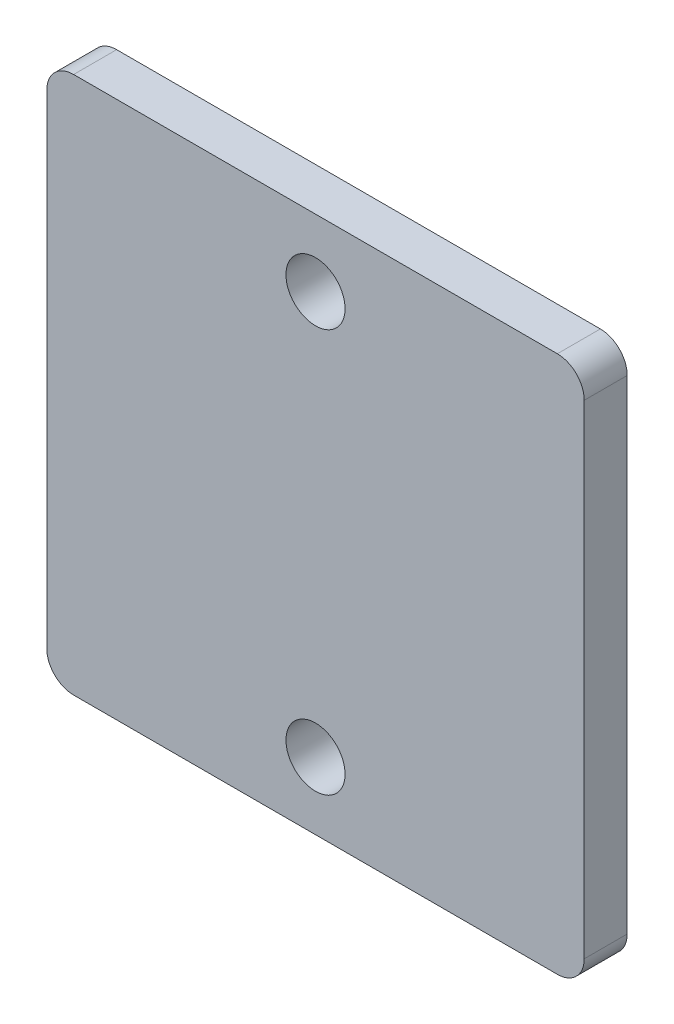
ISO-10303-21;
HEADER;
FILE_DESCRIPTION(('STEP AP214'),'2;1');
FILE_NAME('part.step','',(''),(''),'','','');
FILE_SCHEMA(('AUTOMOTIVE_DESIGN { 1 0 10303 214 1 1 1 1 }'));
ENDSEC;
DATA;
#1=APPLICATION_CONTEXT('core data for automotive mechanical design processes');
#2=APPLICATION_PROTOCOL_DEFINITION('international standard','automotive_design',2000,#1);
#3=PRODUCT_CONTEXT('',#1,'mechanical');
#4=PRODUCT('Part','Part','',(#3));
#5=PRODUCT_RELATED_PRODUCT_CATEGORY('part','',(#4));
#6=PRODUCT_DEFINITION_FORMATION('','',#4);
#7=PRODUCT_DEFINITION_CONTEXT('part definition',#1,'design');
#8=PRODUCT_DEFINITION('design','',#6,#7);
#9=PRODUCT_DEFINITION_SHAPE('','',#8);
#10=(LENGTH_UNIT() NAMED_UNIT(*) SI_UNIT(.MILLI.,.METRE.));
#11=(NAMED_UNIT(*) PLANE_ANGLE_UNIT() SI_UNIT($,.RADIAN.));
#12=(NAMED_UNIT(*) SI_UNIT($,.STERADIAN.) SOLID_ANGLE_UNIT());
#13=UNCERTAINTY_MEASURE_WITH_UNIT(LENGTH_MEASURE(1.E-05),#10,'distance_accuracy_value','');
#14=(GEOMETRIC_REPRESENTATION_CONTEXT(3) GLOBAL_UNCERTAINTY_ASSIGNED_CONTEXT((#13)) GLOBAL_UNIT_ASSIGNED_CONTEXT((#10,
#11,#12)) REPRESENTATION_CONTEXT('',''));
#15=CARTESIAN_POINT('',(0.,0.,0.));
#16=DIRECTION('',(0.,0.,1.));
#17=DIRECTION('',(1.,0.,0.));
#18=AXIS2_PLACEMENT_3D('',#15,#16,#17);
#19=CARTESIAN_POINT('',(-9.,-9.,1.6));
#20=DIRECTION('',(0.,0.,1.));
#21=DIRECTION('',(1.,0.,0.));
#22=AXIS2_PLACEMENT_3D('',#19,#20,#21);
#23=PLANE('',#22);
#24=CARTESIAN_POINT('',(0.,-7.5,1.6));
#25=DIRECTION('',(0.,0.,1.));
#26=DIRECTION('',(1.,0.,0.));
#27=AXIS2_PLACEMENT_3D('',#24,#25,#26);
#28=CIRCLE('',#27,1.1);
#29=CARTESIAN_POINT('',(1.1,-7.5,1.6));
#30=VERTEX_POINT('',#29);
#31=EDGE_CURVE('E142',#30,#30,#28,.T.);
#32=ORIENTED_EDGE('',*,*,#31,.F.);
#33=EDGE_LOOP('',(#32));
#34=FACE_BOUND('',#33,.T.);
#35=CARTESIAN_POINT('',(-9.,-9.,1.6));
#36=DIRECTION('',(0.,0.,1.));
#37=DIRECTION('',(1.,0.,0.));
#38=AXIS2_PLACEMENT_3D('',#35,#36,#37);
#39=CIRCLE('',#38,0.999999999999999);
#40=CARTESIAN_POINT('',(-10.,-9.,1.6));
#41=VERTEX_POINT('',#40);
#42=CARTESIAN_POINT('',(-9.,-10.,1.6));
#43=VERTEX_POINT('',#42);
#44=EDGE_CURVE('E153',#41,#43,#39,.T.);
#45=ORIENTED_EDGE('',*,*,#44,.T.);
#46=DIRECTION('',(1.,0.,0.));
#47=VECTOR('',#46,1.);
#48=CARTESIAN_POINT('',(-9.,-10.,1.6));
#49=LINE('',#48,#47);
#50=CARTESIAN_POINT('',(9.,-10.,1.6));
#51=VERTEX_POINT('',#50);
#52=EDGE_CURVE('E101',#43,#51,#49,.T.);
#53=ORIENTED_EDGE('',*,*,#52,.T.);
#54=CARTESIAN_POINT('',(9.,-9.,1.6));
#55=DIRECTION('',(0.,0.,1.));
#56=DIRECTION('',(1.,0.,0.));
#57=AXIS2_PLACEMENT_3D('',#54,#55,#56);
#58=CIRCLE('',#57,0.999999999999999);
#59=CARTESIAN_POINT('',(10.,-9.,1.6));
#60=VERTEX_POINT('',#59);
#61=EDGE_CURVE('E168',#51,#60,#58,.T.);
#62=ORIENTED_EDGE('',*,*,#61,.T.);
#63=DIRECTION('',(0.,1.,0.));
#64=VECTOR('',#63,1.);
#65=CARTESIAN_POINT('',(10.,-9.,1.6));
#66=LINE('',#65,#64);
#67=CARTESIAN_POINT('',(10.,9.,1.6));
#68=VERTEX_POINT('',#67);
#69=EDGE_CURVE('E181',#60,#68,#66,.T.);
#70=ORIENTED_EDGE('',*,*,#69,.T.);
#71=CARTESIAN_POINT('',(9.,9.,1.6));
#72=DIRECTION('',(0.,0.,1.));
#73=DIRECTION('',(1.,0.,0.));
#74=AXIS2_PLACEMENT_3D('',#71,#72,#73);
#75=CIRCLE('',#74,0.999999999999999);
#76=CARTESIAN_POINT('',(9.,10.,1.6));
#77=VERTEX_POINT('',#76);
#78=EDGE_CURVE('E120',#68,#77,#75,.T.);
#79=ORIENTED_EDGE('',*,*,#78,.T.);
#80=DIRECTION('',(-1.,0.,0.));
#81=VECTOR('',#80,1.);
#82=CARTESIAN_POINT('',(9.,10.,1.6));
#83=LINE('',#82,#81);
#84=CARTESIAN_POINT('',(-9.,10.,1.6));
#85=VERTEX_POINT('',#84);
#86=EDGE_CURVE('E114',#77,#85,#83,.T.);
#87=ORIENTED_EDGE('',*,*,#86,.T.);
#88=CARTESIAN_POINT('',(-9.,9.,1.6));
#89=DIRECTION('',(0.,0.,1.));
#90=DIRECTION('',(1.,0.,0.));
#91=AXIS2_PLACEMENT_3D('',#88,#89,#90);
#92=CIRCLE('',#91,0.999999999999999);
#93=CARTESIAN_POINT('',(-10.,9.,1.6));
#94=VERTEX_POINT('',#93);
#95=EDGE_CURVE('E118',#85,#94,#92,.T.);
#96=ORIENTED_EDGE('',*,*,#95,.T.);
#97=DIRECTION('',(0.,-1.,0.));
#98=VECTOR('',#97,1.);
#99=CARTESIAN_POINT('',(-10.,9.,1.6));
#100=LINE('',#99,#98);
#101=EDGE_CURVE('E58',#94,#41,#100,.T.);
#102=ORIENTED_EDGE('',*,*,#101,.T.);
#103=EDGE_LOOP('',(#45,#53,#62,#70,#79,#87,#96,#102));
#104=FACE_BOUND('',#103,.T.);
#105=CARTESIAN_POINT('',(0.,7.5,1.6));
#106=DIRECTION('',(0.,0.,1.));
#107=DIRECTION('',(1.,0.,0.));
#108=AXIS2_PLACEMENT_3D('',#105,#106,#107);
#109=CIRCLE('',#108,1.1);
#110=CARTESIAN_POINT('',(1.1,7.5,1.6));
#111=VERTEX_POINT('',#110);
#112=EDGE_CURVE('E190',#111,#111,#109,.T.);
#113=ORIENTED_EDGE('',*,*,#112,.F.);
#114=EDGE_LOOP('',(#113));
#115=FACE_BOUND('',#114,.T.);
#116=ADVANCED_FACE('F41',(#34,#104,#115),#23,.T.);
#117=CARTESIAN_POINT('',(-9.,-9.,0.));
#118=DIRECTION('',(0.,0.,1.));
#119=DIRECTION('',(1.,0.,0.));
#120=AXIS2_PLACEMENT_3D('',#117,#118,#119);
#121=PLANE('',#120);
#122=CARTESIAN_POINT('',(-9.,-9.,0.));
#123=DIRECTION('',(0.,0.,1.));
#124=DIRECTION('',(1.,0.,0.));
#125=AXIS2_PLACEMENT_3D('',#122,#123,#124);
#126=CIRCLE('',#125,0.999999999999999);
#127=CARTESIAN_POINT('',(-10.,-9.,0.));
#128=VERTEX_POINT('',#127);
#129=CARTESIAN_POINT('',(-9.,-10.,0.));
#130=VERTEX_POINT('',#129);
#131=EDGE_CURVE('E138',#128,#130,#126,.T.);
#132=ORIENTED_EDGE('',*,*,#131,.F.);
#133=DIRECTION('',(0.,-1.,0.));
#134=VECTOR('',#133,1.);
#135=CARTESIAN_POINT('',(-10.,9.,0.));
#136=LINE('',#135,#134);
#137=CARTESIAN_POINT('',(-10.,9.,0.));
#138=VERTEX_POINT('',#137);
#139=EDGE_CURVE('E93',#138,#128,#136,.T.);
#140=ORIENTED_EDGE('',*,*,#139,.F.);
#141=CARTESIAN_POINT('',(-9.,9.,0.));
#142=DIRECTION('',(0.,0.,1.));
#143=DIRECTION('',(1.,0.,0.));
#144=AXIS2_PLACEMENT_3D('',#141,#142,#143);
#145=CIRCLE('',#144,0.999999999999999);
#146=CARTESIAN_POINT('',(-9.,10.,0.));
#147=VERTEX_POINT('',#146);
#148=EDGE_CURVE('E87',#147,#138,#145,.T.);
#149=ORIENTED_EDGE('',*,*,#148,.F.);
#150=DIRECTION('',(-1.,0.,0.));
#151=VECTOR('',#150,1.);
#152=CARTESIAN_POINT('',(9.,10.,0.));
#153=LINE('',#152,#151);
#154=CARTESIAN_POINT('',(9.,10.,0.));
#155=VERTEX_POINT('',#154);
#156=EDGE_CURVE('E128',#155,#147,#153,.T.);
#157=ORIENTED_EDGE('',*,*,#156,.F.);
#158=CARTESIAN_POINT('',(9.,9.,0.));
#159=DIRECTION('',(0.,0.,1.));
#160=DIRECTION('',(1.,0.,0.));
#161=AXIS2_PLACEMENT_3D('',#158,#159,#160);
#162=CIRCLE('',#161,0.999999999999999);
#163=CARTESIAN_POINT('',(10.,9.,0.));
#164=VERTEX_POINT('',#163);
#165=EDGE_CURVE('E148',#164,#155,#162,.T.);
#166=ORIENTED_EDGE('',*,*,#165,.F.);
#167=DIRECTION('',(0.,1.,0.));
#168=VECTOR('',#167,1.);
#169=CARTESIAN_POINT('',(10.,-9.,0.));
#170=LINE('',#169,#168);
#171=CARTESIAN_POINT('',(10.,-9.,0.));
#172=VERTEX_POINT('',#171);
#173=EDGE_CURVE('E146',#172,#164,#170,.T.);
#174=ORIENTED_EDGE('',*,*,#173,.F.);
#175=CARTESIAN_POINT('',(9.,-9.,0.));
#176=DIRECTION('',(0.,0.,1.));
#177=DIRECTION('',(1.,0.,0.));
#178=AXIS2_PLACEMENT_3D('',#175,#176,#177);
#179=CIRCLE('',#178,0.999999999999999);
#180=CARTESIAN_POINT('',(9.,-10.,0.));
#181=VERTEX_POINT('',#180);
#182=EDGE_CURVE('E144',#181,#172,#179,.T.);
#183=ORIENTED_EDGE('',*,*,#182,.F.);
#184=DIRECTION('',(1.,0.,0.));
#185=VECTOR('',#184,1.);
#186=CARTESIAN_POINT('',(-9.,-10.,0.));
#187=LINE('',#186,#185);
#188=EDGE_CURVE('E141',#130,#181,#187,.T.);
#189=ORIENTED_EDGE('',*,*,#188,.F.);
#190=EDGE_LOOP('',(#132,#140,#149,#157,#166,#174,#183,#189));
#191=FACE_BOUND('',#190,.T.);
#192=CARTESIAN_POINT('',(0.,-7.5,0.));
#193=DIRECTION('',(0.,0.,1.));
#194=DIRECTION('',(1.,0.,0.));
#195=AXIS2_PLACEMENT_3D('',#192,#193,#194);
#196=CIRCLE('',#195,1.1);
#197=CARTESIAN_POINT('',(1.1,-7.5,0.));
#198=VERTEX_POINT('',#197);
#199=EDGE_CURVE('E187',#198,#198,#196,.T.);
#200=ORIENTED_EDGE('',*,*,#199,.T.);
#201=EDGE_LOOP('',(#200));
#202=FACE_BOUND('',#201,.T.);
#203=CARTESIAN_POINT('',(0.,7.5,0.));
#204=DIRECTION('',(0.,0.,1.));
#205=DIRECTION('',(1.,0.,0.));
#206=AXIS2_PLACEMENT_3D('',#203,#204,#205);
#207=CIRCLE('',#206,1.1);
#208=CARTESIAN_POINT('',(1.1,7.5,0.));
#209=VERTEX_POINT('',#208);
#210=EDGE_CURVE('E193',#209,#209,#207,.T.);
#211=ORIENTED_EDGE('',*,*,#210,.T.);
#212=EDGE_LOOP('',(#211));
#213=FACE_BOUND('',#212,.T.);
#214=ADVANCED_FACE('F172',(#191,#202,#213),#121,.F.);
#215=CARTESIAN_POINT('',(-9.,-9.,1.6));
#216=DIRECTION('',(0.,0.,-1.));
#217=DIRECTION('',(-1.,0.,0.));
#218=AXIS2_PLACEMENT_3D('',#215,#216,#217);
#219=CYLINDRICAL_SURFACE('',#218,0.999999999999999);
#220=ORIENTED_EDGE('',*,*,#131,.T.);
#221=DIRECTION('',(0.,0.,-1.));
#222=VECTOR('',#221,1.);
#223=CARTESIAN_POINT('',(-9.,-10.,1.6));
#224=LINE('',#223,#222);
#225=EDGE_CURVE('E11',#43,#130,#224,.T.);
#226=ORIENTED_EDGE('',*,*,#225,.F.);
#227=ORIENTED_EDGE('',*,*,#44,.F.);
#228=DIRECTION('',(0.,0.,-1.));
#229=VECTOR('',#228,1.);
#230=CARTESIAN_POINT('',(-10.,-9.,1.6));
#231=LINE('',#230,#229);
#232=EDGE_CURVE('E134',#41,#128,#231,.T.);
#233=ORIENTED_EDGE('',*,*,#232,.T.);
#234=EDGE_LOOP('',(#220,#226,#227,#233));
#235=FACE_BOUND('',#234,.T.);
#236=ADVANCED_FACE('F43',(#235),#219,.T.);
#237=CARTESIAN_POINT('',(-9.,-10.,1.6));
#238=DIRECTION('',(0.,1.,0.));
#239=DIRECTION('',(0.,0.,1.));
#240=AXIS2_PLACEMENT_3D('',#237,#238,#239);
#241=PLANE('',#240);
#242=ORIENTED_EDGE('',*,*,#188,.T.);
#243=DIRECTION('',(0.,0.,-1.));
#244=VECTOR('',#243,1.);
#245=CARTESIAN_POINT('',(9.,-10.,1.6));
#246=LINE('',#245,#244);
#247=EDGE_CURVE('E50',#51,#181,#246,.T.);
#248=ORIENTED_EDGE('',*,*,#247,.F.);
#249=ORIENTED_EDGE('',*,*,#52,.F.);
#250=ORIENTED_EDGE('',*,*,#225,.T.);
#251=EDGE_LOOP('',(#242,#248,#249,#250));
#252=FACE_BOUND('',#251,.T.);
#253=ADVANCED_FACE('F225',(#252),#241,.F.);
#254=CARTESIAN_POINT('',(9.,-9.,1.6));
#255=DIRECTION('',(0.,0.,-1.));
#256=DIRECTION('',(-1.,0.,0.));
#257=AXIS2_PLACEMENT_3D('',#254,#255,#256);
#258=CYLINDRICAL_SURFACE('',#257,0.999999999999999);
#259=ORIENTED_EDGE('',*,*,#182,.T.);
#260=DIRECTION('',(0.,0.,-1.));
#261=VECTOR('',#260,1.);
#262=CARTESIAN_POINT('',(10.,-9.,1.6));
#263=LINE('',#262,#261);
#264=EDGE_CURVE('E160',#60,#172,#263,.T.);
#265=ORIENTED_EDGE('',*,*,#264,.F.);
#266=ORIENTED_EDGE('',*,*,#61,.F.);
#267=ORIENTED_EDGE('',*,*,#247,.T.);
#268=EDGE_LOOP('',(#259,#265,#266,#267));
#269=FACE_BOUND('',#268,.T.);
#270=ADVANCED_FACE('F166',(#269),#258,.T.);
#271=CARTESIAN_POINT('',(10.,-9.,1.6));
#272=DIRECTION('',(-1.,0.,0.));
#273=DIRECTION('',(0.,0.,1.));
#274=AXIS2_PLACEMENT_3D('',#271,#272,#273);
#275=PLANE('',#274);
#276=ORIENTED_EDGE('',*,*,#173,.T.);
#277=DIRECTION('',(0.,0.,-1.));
#278=VECTOR('',#277,1.);
#279=CARTESIAN_POINT('',(10.,9.,1.6));
#280=LINE('',#279,#278);
#281=EDGE_CURVE('E157',#68,#164,#280,.T.);
#282=ORIENTED_EDGE('',*,*,#281,.F.);
#283=ORIENTED_EDGE('',*,*,#69,.F.);
#284=ORIENTED_EDGE('',*,*,#264,.T.);
#285=EDGE_LOOP('',(#276,#282,#283,#284));
#286=FACE_BOUND('',#285,.T.);
#287=ADVANCED_FACE('F177',(#286),#275,.F.);
#288=CARTESIAN_POINT('',(9.,9.,1.6));
#289=DIRECTION('',(0.,0.,-1.));
#290=DIRECTION('',(-1.,0.,0.));
#291=AXIS2_PLACEMENT_3D('',#288,#289,#290);
#292=CYLINDRICAL_SURFACE('',#291,0.999999999999999);
#293=ORIENTED_EDGE('',*,*,#165,.T.);
#294=DIRECTION('',(0.,0.,-1.));
#295=VECTOR('',#294,1.);
#296=CARTESIAN_POINT('',(9.,10.,1.6));
#297=LINE('',#296,#295);
#298=EDGE_CURVE('E129',#77,#155,#297,.T.);
#299=ORIENTED_EDGE('',*,*,#298,.F.);
#300=ORIENTED_EDGE('',*,*,#78,.F.);
#301=ORIENTED_EDGE('',*,*,#281,.T.);
#302=EDGE_LOOP('',(#293,#299,#300,#301));
#303=FACE_BOUND('',#302,.T.);
#304=ADVANCED_FACE('F180',(#303),#292,.T.);
#305=CARTESIAN_POINT('',(9.,10.,1.6));
#306=DIRECTION('',(0.,-1.,0.));
#307=DIRECTION('',(0.,0.,-1.));
#308=AXIS2_PLACEMENT_3D('',#305,#306,#307);
#309=PLANE('',#308);
#310=ORIENTED_EDGE('',*,*,#156,.T.);
#311=DIRECTION('',(0.,0.,-1.));
#312=VECTOR('',#311,1.);
#313=CARTESIAN_POINT('',(-9.,10.,1.6));
#314=LINE('',#313,#312);
#315=EDGE_CURVE('E125',#85,#147,#314,.T.);
#316=ORIENTED_EDGE('',*,*,#315,.F.);
#317=ORIENTED_EDGE('',*,*,#86,.F.);
#318=ORIENTED_EDGE('',*,*,#298,.T.);
#319=EDGE_LOOP('',(#310,#316,#317,#318));
#320=FACE_BOUND('',#319,.T.);
#321=ADVANCED_FACE('F126',(#320),#309,.F.);
#322=CARTESIAN_POINT('',(-9.,9.,1.6));
#323=DIRECTION('',(0.,0.,-1.));
#324=DIRECTION('',(-1.,0.,0.));
#325=AXIS2_PLACEMENT_3D('',#322,#323,#324);
#326=CYLINDRICAL_SURFACE('',#325,0.999999999999999);
#327=ORIENTED_EDGE('',*,*,#148,.T.);
#328=DIRECTION('',(0.,0.,-1.));
#329=VECTOR('',#328,1.);
#330=CARTESIAN_POINT('',(-10.,9.,1.6));
#331=LINE('',#330,#329);
#332=EDGE_CURVE('E130',#94,#138,#331,.T.);
#333=ORIENTED_EDGE('',*,*,#332,.F.);
#334=ORIENTED_EDGE('',*,*,#95,.F.);
#335=ORIENTED_EDGE('',*,*,#315,.T.);
#336=EDGE_LOOP('',(#327,#333,#334,#335));
#337=FACE_BOUND('',#336,.T.);
#338=ADVANCED_FACE('F132',(#337),#326,.T.);
#339=CARTESIAN_POINT('',(-10.,9.,1.6));
#340=DIRECTION('',(1.,0.,0.));
#341=DIRECTION('',(0.,0.,-1.));
#342=AXIS2_PLACEMENT_3D('',#339,#340,#341);
#343=PLANE('',#342);
#344=ORIENTED_EDGE('',*,*,#139,.T.);
#345=ORIENTED_EDGE('',*,*,#232,.F.);
#346=ORIENTED_EDGE('',*,*,#101,.F.);
#347=ORIENTED_EDGE('',*,*,#332,.T.);
#348=EDGE_LOOP('',(#344,#345,#346,#347));
#349=FACE_BOUND('',#348,.T.);
#350=ADVANCED_FACE('F213',(#349),#343,.F.);
#351=CARTESIAN_POINT('',(0.,-7.5,1.6));
#352=DIRECTION('',(0.,0.,-1.));
#353=DIRECTION('',(-1.,0.,0.));
#354=AXIS2_PLACEMENT_3D('',#351,#352,#353);
#355=CYLINDRICAL_SURFACE('',#354,1.1);
#356=ORIENTED_EDGE('',*,*,#31,.T.);
#357=EDGE_LOOP('',(#356));
#358=FACE_BOUND('',#357,.T.);
#359=ORIENTED_EDGE('',*,*,#199,.F.);
#360=EDGE_LOOP('',(#359));
#361=FACE_BOUND('',#360,.T.);
#362=ADVANCED_FACE('F210',(#358,#361),#355,.F.);
#363=CARTESIAN_POINT('',(0.,7.5,1.6));
#364=DIRECTION('',(0.,0.,-1.));
#365=DIRECTION('',(-1.,0.,0.));
#366=AXIS2_PLACEMENT_3D('',#363,#364,#365);
#367=CYLINDRICAL_SURFACE('',#366,1.1);
#368=ORIENTED_EDGE('',*,*,#112,.T.);
#369=EDGE_LOOP('',(#368));
#370=FACE_BOUND('',#369,.T.);
#371=ORIENTED_EDGE('',*,*,#210,.F.);
#372=EDGE_LOOP('',(#371));
#373=FACE_BOUND('',#372,.T.);
#374=ADVANCED_FACE('F199',(#370,#373),#367,.F.);
#375=CLOSED_SHELL('',(#116,#214,#236,#253,#270,#287,#304,#321,#338,#350,#362,#374));
#376=MANIFOLD_SOLID_BREP('B2',#375);
#377=ADVANCED_BREP_SHAPE_REPRESENTATION('',(#18,#376),#14);
#378=SHAPE_DEFINITION_REPRESENTATION(#9,#377);
ENDSEC;
END-ISO-10303-21;
